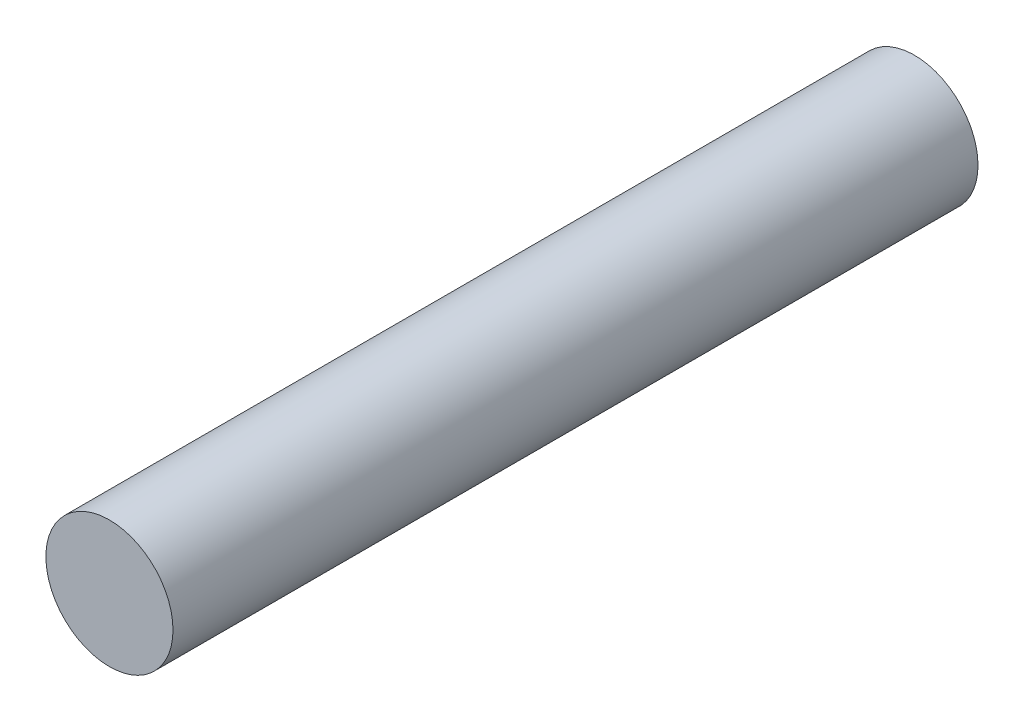
ISO-10303-21;
HEADER;
FILE_DESCRIPTION(('STEP AP214'),'2;1');
FILE_NAME('part.step','',(''),(''),'','','');
FILE_SCHEMA(('AUTOMOTIVE_DESIGN { 1 0 10303 214 1 1 1 1 }'));
ENDSEC;
DATA;
#1=APPLICATION_CONTEXT('core data for automotive mechanical design processes');
#2=APPLICATION_PROTOCOL_DEFINITION('international standard','automotive_design',2000,#1);
#3=PRODUCT_CONTEXT('',#1,'mechanical');
#4=PRODUCT('Part','Part','',(#3));
#5=PRODUCT_RELATED_PRODUCT_CATEGORY('part','',(#4));
#6=PRODUCT_DEFINITION_FORMATION('','',#4);
#7=PRODUCT_DEFINITION_CONTEXT('part definition',#1,'design');
#8=PRODUCT_DEFINITION('design','',#6,#7);
#9=PRODUCT_DEFINITION_SHAPE('','',#8);
#10=(LENGTH_UNIT() NAMED_UNIT(*) SI_UNIT(.MILLI.,.METRE.));
#11=(NAMED_UNIT(*) PLANE_ANGLE_UNIT() SI_UNIT($,.RADIAN.));
#12=(NAMED_UNIT(*) SI_UNIT($,.STERADIAN.) SOLID_ANGLE_UNIT());
#13=UNCERTAINTY_MEASURE_WITH_UNIT(LENGTH_MEASURE(1.E-05),#10,'distance_accuracy_value','');
#14=(GEOMETRIC_REPRESENTATION_CONTEXT(3) GLOBAL_UNCERTAINTY_ASSIGNED_CONTEXT((#13)) GLOBAL_UNIT_ASSIGNED_CONTEXT((#10,
#11,#12)) REPRESENTATION_CONTEXT('',''));
#15=CARTESIAN_POINT('',(0.,0.,0.));
#16=DIRECTION('',(0.,0.,1.));
#17=DIRECTION('',(1.,0.,0.));
#18=AXIS2_PLACEMENT_3D('',#15,#16,#17);
#19=CARTESIAN_POINT('',(0.,0.,-15.08125));
#20=DIRECTION('',(0.,0.,1.));
#21=DIRECTION('',(1.,0.,0.));
#22=AXIS2_PLACEMENT_3D('',#19,#20,#21);
#23=CYLINDRICAL_SURFACE('',#22,2.38125);
#24=CARTESIAN_POINT('',(0.,0.,-15.08125));
#25=DIRECTION('',(0.,0.,1.));
#26=DIRECTION('',(1.,0.,0.));
#27=AXIS2_PLACEMENT_3D('',#24,#25,#26);
#28=CIRCLE('',#27,2.38125);
#29=CARTESIAN_POINT('',(2.38125,0.,-15.08125));
#30=VERTEX_POINT('',#29);
#31=EDGE_CURVE('E10',#30,#30,#28,.T.);
#32=CARTESIAN_POINT('',(0.,0.,15.08125));
#33=DIRECTION('',(0.,0.,1.));
#34=DIRECTION('',(1.,0.,0.));
#35=AXIS2_PLACEMENT_3D('',#32,#33,#34);
#36=CIRCLE('',#35,2.38125);
#37=CARTESIAN_POINT('',(2.38125,0.,15.08125));
#38=VERTEX_POINT('',#37);
#39=EDGE_CURVE('E38',#38,#38,#36,.T.);
#40=CARTESIAN_POINT('',(2.38125,0.,-15.08125));
#41=CARTESIAN_POINT('',(2.38125,0.,-14.7670572916667));
#42=CARTESIAN_POINT('',(2.38125,0.,-14.4528645833333));
#43=CARTESIAN_POINT('',(2.38125,0.,-13.8244791666667));
#44=CARTESIAN_POINT('',(2.38125,0.,-13.5102864583333));
#45=CARTESIAN_POINT('',(2.38125,0.,-12.8819010416667));
#46=CARTESIAN_POINT('',(2.38125,0.,-12.5677083333333));
#47=CARTESIAN_POINT('',(2.38125,0.,-11.9393229166667));
#48=CARTESIAN_POINT('',(2.38125,0.,-11.6251302083333));
#49=CARTESIAN_POINT('',(2.38125,0.,-10.9967447916667));
#50=CARTESIAN_POINT('',(2.38125,0.,-10.6825520833333));
#51=CARTESIAN_POINT('',(2.38125,0.,-10.0541666666667));
#52=CARTESIAN_POINT('',(2.38125,0.,-9.73997395833333));
#53=CARTESIAN_POINT('',(2.38125,0.,-9.11158854166667));
#54=CARTESIAN_POINT('',(2.38125,0.,-8.79739583333333));
#55=CARTESIAN_POINT('',(2.38125,0.,-8.16901041666667));
#56=CARTESIAN_POINT('',(2.38125,0.,-7.85481770833333));
#57=CARTESIAN_POINT('',(2.38125,0.,-7.22643229166667));
#58=CARTESIAN_POINT('',(2.38125,0.,-6.91223958333333));
#59=CARTESIAN_POINT('',(2.38125,0.,-6.28385416666667));
#60=CARTESIAN_POINT('',(2.38125,0.,-5.96966145833334));
#61=CARTESIAN_POINT('',(2.38125,0.,-5.34127604166667));
#62=CARTESIAN_POINT('',(2.38125,0.,-5.02708333333334));
#63=CARTESIAN_POINT('',(2.38125,0.,-4.39869791666667));
#64=CARTESIAN_POINT('',(2.38125,0.,-4.08450520833334));
#65=CARTESIAN_POINT('',(2.38125,0.,-3.45611979166667));
#66=CARTESIAN_POINT('',(2.38125,0.,-3.14192708333334));
#67=CARTESIAN_POINT('',(2.38125,0.,-2.51354166666667));
#68=CARTESIAN_POINT('',(2.38125,0.,-2.19934895833334));
#69=CARTESIAN_POINT('',(2.38125,0.,-1.57096354166667));
#70=CARTESIAN_POINT('',(2.38125,0.,-1.25677083333333));
#71=CARTESIAN_POINT('',(2.38125,0.,-0.628385416666668));
#72=CARTESIAN_POINT('',(2.38125,0.,-0.314192708333335));
#73=CARTESIAN_POINT('',(2.38125,0.,0.314192708333331));
#74=CARTESIAN_POINT('',(2.38125,0.,0.628385416666664));
#75=CARTESIAN_POINT('',(2.38125,0.,1.25677083333333));
#76=CARTESIAN_POINT('',(2.38125,0.,1.57096354166666));
#77=CARTESIAN_POINT('',(2.38125,0.,2.19934895833333));
#78=CARTESIAN_POINT('',(2.38125,0.,2.51354166666667));
#79=CARTESIAN_POINT('',(2.38125,0.,3.14192708333333));
#80=CARTESIAN_POINT('',(2.38125,0.,3.45611979166667));
#81=CARTESIAN_POINT('',(2.38125,0.,4.08450520833333));
#82=CARTESIAN_POINT('',(2.38125,0.,4.39869791666667));
#83=CARTESIAN_POINT('',(2.38125,0.,5.02708333333333));
#84=CARTESIAN_POINT('',(2.38125,0.,5.34127604166666));
#85=CARTESIAN_POINT('',(2.38125,0.,5.96966145833333));
#86=CARTESIAN_POINT('',(2.38125,0.,6.28385416666666));
#87=CARTESIAN_POINT('',(2.38125,0.,6.91223958333333));
#88=CARTESIAN_POINT('',(2.38125,0.,7.22643229166666));
#89=CARTESIAN_POINT('',(2.38125,0.,7.85481770833333));
#90=CARTESIAN_POINT('',(2.38125,0.,8.16901041666667));
#91=CARTESIAN_POINT('',(2.38125,0.,8.79739583333333));
#92=CARTESIAN_POINT('',(2.38125,0.,9.11158854166667));
#93=CARTESIAN_POINT('',(2.38125,0.,9.73997395833333));
#94=CARTESIAN_POINT('',(2.38125,0.,10.0541666666667));
#95=CARTESIAN_POINT('',(2.38125,0.,10.6825520833333));
#96=CARTESIAN_POINT('',(2.38125,0.,10.9967447916667));
#97=CARTESIAN_POINT('',(2.38125,0.,11.6251302083333));
#98=CARTESIAN_POINT('',(2.38125,0.,11.9393229166667));
#99=CARTESIAN_POINT('',(2.38125,0.,12.5677083333333));
#100=CARTESIAN_POINT('',(2.38125,0.,12.8819010416667));
#101=CARTESIAN_POINT('',(2.38125,0.,13.5102864583333));
#102=CARTESIAN_POINT('',(2.38125,0.,13.8244791666667));
#103=CARTESIAN_POINT('',(2.38125,0.,14.4528645833333));
#104=CARTESIAN_POINT('',(2.38125,0.,14.7670572916667));
#105=CARTESIAN_POINT('',(2.38125,0.,15.08125));
#106=B_SPLINE_CURVE_WITH_KNOTS('',3,(#40,#41,#42,#43,#44,#45,#46,#47,#48,#49,#50,#51,#52,#53,
#54,#55,#56,#57,#58,#59,#60,#61,#62,#63,#64,#65,#66,#67,#68,#69,#70,#71,#72,#73,#74,#75,#76,#77,
#78,#79,#80,#81,#82,#83,#84,#85,#86,#87,#88,#89,#90,#91,#92,#93,#94,#95,#96,#97,#98,#99,#100,
#101,#102,#103,#104,#105),.UNSPECIFIED.,.F.,.F.,(4,2,2,2,2,2,2,2,2,2,2,2,2,2,2,2,2,2,2,2,2,2,2,
2,2,2,2,2,2,2,2,2,4),(0.,0.942578125000001,1.88515625,2.827734375,3.7703125,4.712890625,
5.65546875,6.598046875,7.540625,8.483203125,9.42578125,10.368359375,11.3109375,12.253515625,
13.19609375,14.138671875,15.08125,16.023828125,16.96640625,17.908984375,18.8515625,19.794140625,
20.73671875,21.679296875,22.621875,23.564453125,24.50703125,25.449609375,26.3921875,
27.334765625,28.27734375,29.219921875,30.1625),.UNSPECIFIED.);
#107=EDGE_CURVE('BSEAM35',#30,#38,#106,.T.);
#108=ORIENTED_EDGE('',*,*,#31,.T.);
#109=ORIENTED_EDGE('',*,*,#39,.F.);
#110=ORIENTED_EDGE('',*,*,#107,.T.);
#111=ORIENTED_EDGE('',*,*,#107,.F.);
#112=EDGE_LOOP('',(#108,#110,#109,#111));
#113=FACE_BOUND('',#112,.T.);
#114=ADVANCED_FACE('F35',(#113),#23,.T.);
#115=CARTESIAN_POINT('',(0.,0.,-15.08125));
#116=DIRECTION('',(0.,0.,1.));
#117=DIRECTION('',(1.,0.,0.));
#118=AXIS2_PLACEMENT_3D('',#115,#116,#117);
#119=PLANE('',#118);
#120=ORIENTED_EDGE('',*,*,#31,.F.);
#121=EDGE_LOOP('',(#120));
#122=FACE_BOUND('',#121,.T.);
#123=ADVANCED_FACE('F50',(#122),#119,.F.);
#124=CARTESIAN_POINT('',(0.,0.,15.08125));
#125=DIRECTION('',(0.,0.,1.));
#126=DIRECTION('',(1.,0.,0.));
#127=AXIS2_PLACEMENT_3D('',#124,#125,#126);
#128=PLANE('',#127);
#129=ORIENTED_EDGE('',*,*,#39,.T.);
#130=EDGE_LOOP('',(#129));
#131=FACE_BOUND('',#130,.T.);
#132=ADVANCED_FACE('F47',(#131),#128,.T.);
#133=CLOSED_SHELL('',(#114,#123,#132));
#134=MANIFOLD_SOLID_BREP('B2',#133);
#135=ADVANCED_BREP_SHAPE_REPRESENTATION('',(#18,#134),#14);
#136=SHAPE_DEFINITION_REPRESENTATION(#9,#135);
ENDSEC;
END-ISO-10303-21;
